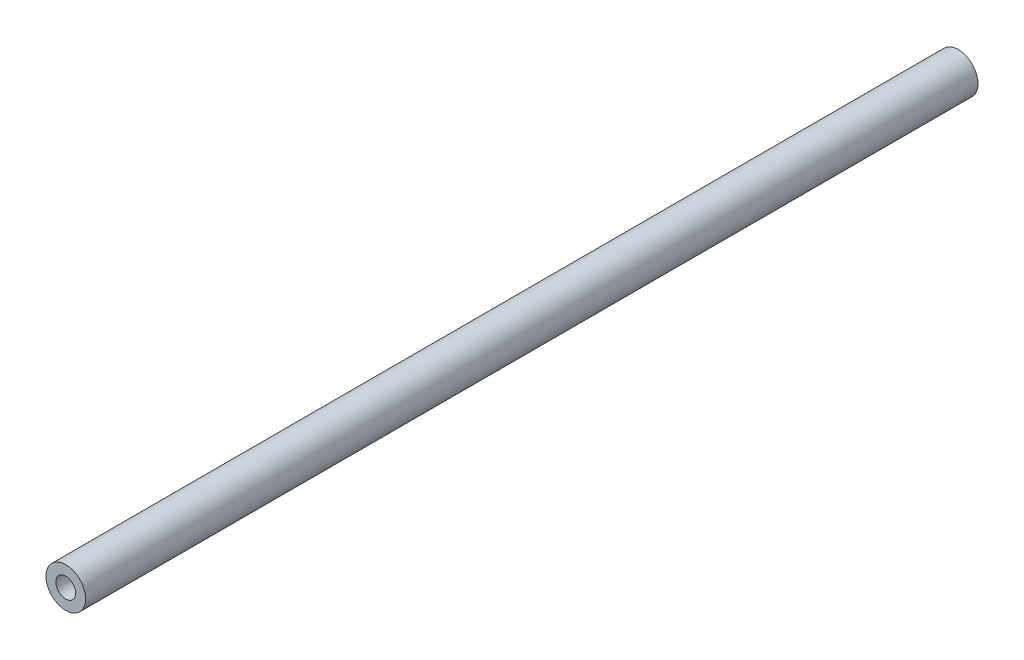
ISO-10303-21;
HEADER;
FILE_DESCRIPTION(('STEP AP214'),'2;1');
FILE_NAME('part.step','',(''),(''),'','','');
FILE_SCHEMA(('AUTOMOTIVE_DESIGN { 1 0 10303 214 1 1 1 1 }'));
ENDSEC;
DATA;
#1=APPLICATION_CONTEXT('core data for automotive mechanical design processes');
#2=APPLICATION_PROTOCOL_DEFINITION('international standard','automotive_design',2000,#1);
#3=PRODUCT_CONTEXT('',#1,'mechanical');
#4=PRODUCT('Part','Part','',(#3));
#5=PRODUCT_RELATED_PRODUCT_CATEGORY('part','',(#4));
#6=PRODUCT_DEFINITION_FORMATION('','',#4);
#7=PRODUCT_DEFINITION_CONTEXT('part definition',#1,'design');
#8=PRODUCT_DEFINITION('design','',#6,#7);
#9=PRODUCT_DEFINITION_SHAPE('','',#8);
#10=(LENGTH_UNIT() NAMED_UNIT(*) SI_UNIT(.MILLI.,.METRE.));
#11=(NAMED_UNIT(*) PLANE_ANGLE_UNIT() SI_UNIT($,.RADIAN.));
#12=(NAMED_UNIT(*) SI_UNIT($,.STERADIAN.) SOLID_ANGLE_UNIT());
#13=UNCERTAINTY_MEASURE_WITH_UNIT(LENGTH_MEASURE(1.E-05),#10,'distance_accuracy_value','');
#14=(GEOMETRIC_REPRESENTATION_CONTEXT(3) GLOBAL_UNCERTAINTY_ASSIGNED_CONTEXT((#13)) GLOBAL_UNIT_ASSIGNED_CONTEXT((#10,
#11,#12)) REPRESENTATION_CONTEXT('',''));
#15=CARTESIAN_POINT('',(0.,0.,0.));
#16=DIRECTION('',(0.,0.,1.));
#17=DIRECTION('',(1.,0.,0.));
#18=AXIS2_PLACEMENT_3D('',#15,#16,#17);
#19=CARTESIAN_POINT('',(0.,0.,450.));
#20=DIRECTION('',(0.,0.,1.));
#21=DIRECTION('',(1.,0.,0.));
#22=AXIS2_PLACEMENT_3D('',#19,#20,#21);
#23=PLANE('',#22);
#24=CARTESIAN_POINT('',(0.,0.,450.));
#25=DIRECTION('',(0.,0.,1.));
#26=DIRECTION('',(1.,0.,0.));
#27=AXIS2_PLACEMENT_3D('',#24,#25,#26);
#28=CIRCLE('',#27,10.);
#29=CARTESIAN_POINT('',(10.,0.,450.));
#30=VERTEX_POINT('',#29);
#31=EDGE_CURVE('E10',#30,#30,#28,.T.);
#32=ORIENTED_EDGE('',*,*,#31,.T.);
#33=EDGE_LOOP('',(#32));
#34=FACE_BOUND('',#33,.T.);
#35=CARTESIAN_POINT('',(0.,0.,450.));
#36=DIRECTION('',(0.,0.,1.));
#37=DIRECTION('',(1.,0.,0.));
#38=AXIS2_PLACEMENT_3D('',#35,#36,#37);
#39=CIRCLE('',#38,5.);
#40=CARTESIAN_POINT('',(5.,0.,450.));
#41=VERTEX_POINT('',#40);
#42=EDGE_CURVE('E42',#41,#41,#39,.T.);
#43=ORIENTED_EDGE('',*,*,#42,.F.);
#44=EDGE_LOOP('',(#43));
#45=FACE_BOUND('',#44,.T.);
#46=ADVANCED_FACE('F31',(#34,#45),#23,.T.);
#47=CARTESIAN_POINT('',(0.,0.,0.));
#48=DIRECTION('',(0.,0.,1.));
#49=DIRECTION('',(1.,0.,0.));
#50=AXIS2_PLACEMENT_3D('',#47,#48,#49);
#51=PLANE('',#50);
#52=CARTESIAN_POINT('',(0.,0.,0.));
#53=DIRECTION('',(0.,0.,1.));
#54=DIRECTION('',(1.,0.,0.));
#55=AXIS2_PLACEMENT_3D('',#52,#53,#54);
#56=CIRCLE('',#55,10.);
#57=CARTESIAN_POINT('',(10.,0.,0.));
#58=VERTEX_POINT('',#57);
#59=EDGE_CURVE('E35',#58,#58,#56,.T.);
#60=ORIENTED_EDGE('',*,*,#59,.F.);
#61=EDGE_LOOP('',(#60));
#62=FACE_BOUND('',#61,.T.);
#63=CARTESIAN_POINT('',(0.,0.,0.));
#64=DIRECTION('',(0.,0.,1.));
#65=DIRECTION('',(1.,0.,0.));
#66=AXIS2_PLACEMENT_3D('',#63,#64,#65);
#67=CIRCLE('',#66,5.);
#68=CARTESIAN_POINT('',(5.,0.,0.));
#69=VERTEX_POINT('',#68);
#70=EDGE_CURVE('E44',#69,#69,#67,.T.);
#71=ORIENTED_EDGE('',*,*,#70,.T.);
#72=EDGE_LOOP('',(#71));
#73=FACE_BOUND('',#72,.T.);
#74=ADVANCED_FACE('F54',(#62,#73),#51,.F.);
#75=CARTESIAN_POINT('',(0.,0.,450.));
#76=DIRECTION('',(0.,0.,-1.));
#77=DIRECTION('',(-1.,0.,0.));
#78=AXIS2_PLACEMENT_3D('',#75,#76,#77);
#79=CYLINDRICAL_SURFACE('',#78,10.);
#80=ORIENTED_EDGE('',*,*,#31,.F.);
#81=EDGE_LOOP('',(#80));
#82=FACE_BOUND('',#81,.T.);
#83=ORIENTED_EDGE('',*,*,#59,.T.);
#84=EDGE_LOOP('',(#83));
#85=FACE_BOUND('',#84,.T.);
#86=ADVANCED_FACE('F33',(#82,#85),#79,.T.);
#87=CARTESIAN_POINT('',(0.,0.,450.));
#88=DIRECTION('',(0.,0.,-1.));
#89=DIRECTION('',(-1.,0.,0.));
#90=AXIS2_PLACEMENT_3D('',#87,#88,#89);
#91=CYLINDRICAL_SURFACE('',#90,5.);
#92=ORIENTED_EDGE('',*,*,#42,.T.);
#93=EDGE_LOOP('',(#92));
#94=FACE_BOUND('',#93,.T.);
#95=ORIENTED_EDGE('',*,*,#70,.F.);
#96=EDGE_LOOP('',(#95));
#97=FACE_BOUND('',#96,.T.);
#98=ADVANCED_FACE('F50',(#94,#97),#91,.F.);
#99=CLOSED_SHELL('',(#46,#74,#86,#98));
#100=MANIFOLD_SOLID_BREP('B2',#99);
#101=ADVANCED_BREP_SHAPE_REPRESENTATION('',(#18,#100),#14);
#102=SHAPE_DEFINITION_REPRESENTATION(#9,#101);
ENDSEC;
END-ISO-10303-21;
